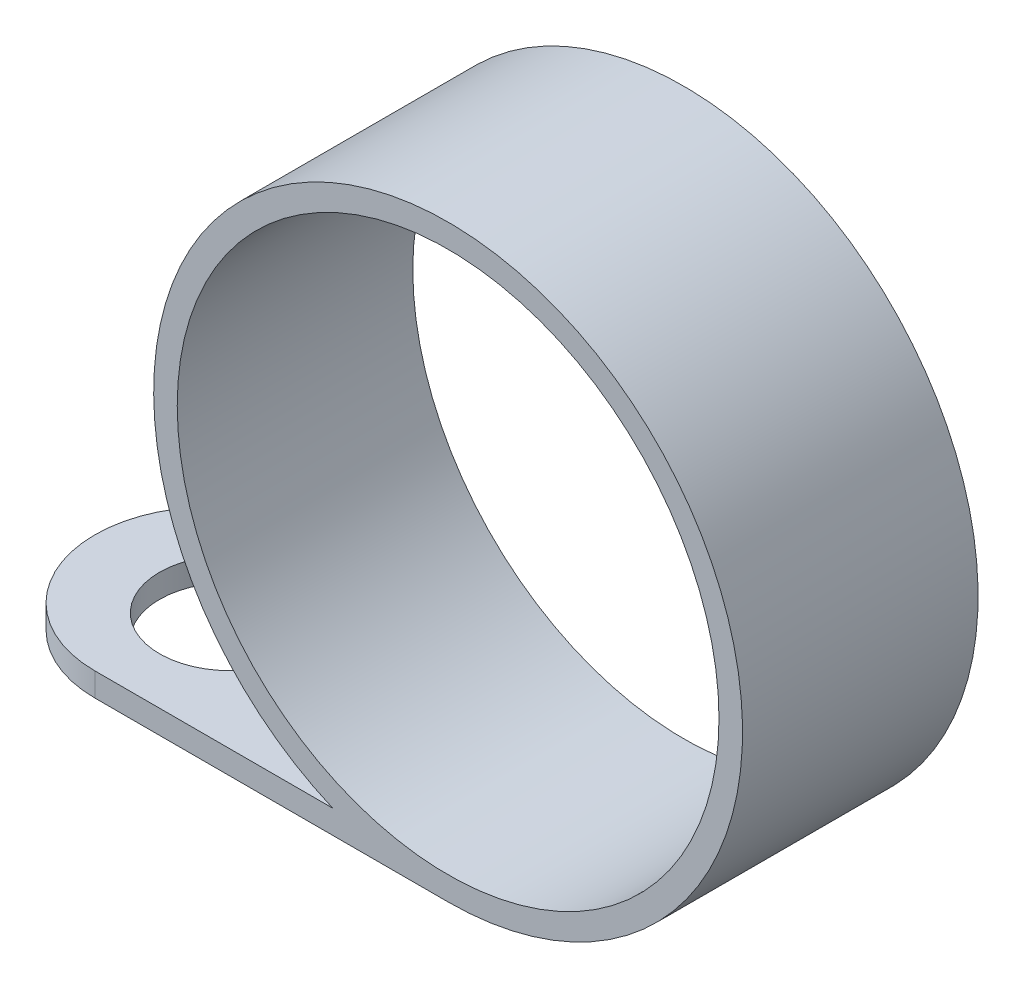
ISO-10303-21;
HEADER;
FILE_DESCRIPTION(('STEP AP214'),'2;1');
FILE_NAME('part.step','',(''),(''),'','','');
FILE_SCHEMA(('AUTOMOTIVE_DESIGN { 1 0 10303 214 1 1 1 1 }'));
ENDSEC;
DATA;
#1=APPLICATION_CONTEXT('core data for automotive mechanical design processes');
#2=APPLICATION_PROTOCOL_DEFINITION('international standard','automotive_design',2000,#1);
#3=PRODUCT_CONTEXT('',#1,'mechanical');
#4=PRODUCT('Part','Part','',(#3));
#5=PRODUCT_RELATED_PRODUCT_CATEGORY('part','',(#4));
#6=PRODUCT_DEFINITION_FORMATION('','',#4);
#7=PRODUCT_DEFINITION_CONTEXT('part definition',#1,'design');
#8=PRODUCT_DEFINITION('design','',#6,#7);
#9=PRODUCT_DEFINITION_SHAPE('','',#8);
#10=(LENGTH_UNIT() NAMED_UNIT(*) SI_UNIT(.MILLI.,.METRE.));
#11=(NAMED_UNIT(*) PLANE_ANGLE_UNIT() SI_UNIT($,.RADIAN.));
#12=(NAMED_UNIT(*) SI_UNIT($,.STERADIAN.) SOLID_ANGLE_UNIT());
#13=UNCERTAINTY_MEASURE_WITH_UNIT(LENGTH_MEASURE(1.E-05),#10,'distance_accuracy_value','');
#14=(GEOMETRIC_REPRESENTATION_CONTEXT(3) GLOBAL_UNCERTAINTY_ASSIGNED_CONTEXT((#13)) GLOBAL_UNIT_ASSIGNED_CONTEXT((#10,
#11,#12)) REPRESENTATION_CONTEXT('',''));
#15=CARTESIAN_POINT('',(0.,0.,0.));
#16=DIRECTION('',(0.,0.,1.));
#17=DIRECTION('',(1.,0.,0.));
#18=AXIS2_PLACEMENT_3D('',#15,#16,#17);
#19=CARTESIAN_POINT('',(5.76916572614213,3.97081850238151,4.819015));
#20=DIRECTION('',(0.,0.,-1.));
#21=DIRECTION('',(-1.,0.,0.));
#22=AXIS2_PLACEMENT_3D('',#19,#20,#21);
#23=PLANE('',#22);
#24=DIRECTION('',(-1.,0.,0.));
#25=VECTOR('',#24,1.);
#26=CARTESIAN_POINT('',(-8.42689427385787,-4.19191599761849,4.819015));
#27=LINE('',#26,#25);
#28=CARTESIAN_POINT('',(2.29185539034867,-4.19191599761849,4.819015));
#29=VERTEX_POINT('',#28);
#30=CARTESIAN_POINT('',(-4.87787927385787,-4.19191599761849,4.819015));
#31=VERTEX_POINT('',#30);
#32=EDGE_CURVE('E117',#29,#31,#27,.T.);
#33=ORIENTED_EDGE('',*,*,#32,.T.);
#34=DIRECTION('',(0.,-1.,0.));
#35=VECTOR('',#34,1.);
#36=CARTESIAN_POINT('',(-4.87787927385787,3.97081850238151,4.819015));
#37=LINE('',#36,#35);
#38=CARTESIAN_POINT('',(-4.87787927385787,-4.90171899761849,4.819015));
#39=VERTEX_POINT('',#38);
#40=EDGE_CURVE('E99',#31,#39,#37,.T.);
#41=ORIENTED_EDGE('',*,*,#40,.T.);
#42=DIRECTION('',(1.,0.,0.));
#43=VECTOR('',#42,1.);
#44=CARTESIAN_POINT('',(-8.42689427385787,-4.90171899761849,4.819015));
#45=LINE('',#44,#43);
#46=CARTESIAN_POINT('',(5.76916572614213,-4.90171899761849,4.819015));
#47=VERTEX_POINT('',#46);
#48=EDGE_CURVE('E91',#39,#47,#45,.T.);
#49=ORIENTED_EDGE('',*,*,#48,.T.);
#50=CARTESIAN_POINT('',(5.76916572614213,3.97081850238151,4.819015));
#51=DIRECTION('',(0.,0.,1.));
#52=DIRECTION('',(-1.,0.,0.));
#53=AXIS2_PLACEMENT_3D('',#50,#51,#52);
#54=CIRCLE('',#53,8.8725375);
#55=EDGE_CURVE('E96',#47,#29,#54,.T.);
#56=ORIENTED_EDGE('',*,*,#55,.T.);
#57=EDGE_LOOP('',(#33,#41,#49,#56));
#58=FACE_BOUND('',#57,.T.);
#59=CARTESIAN_POINT('',(5.76916572614213,3.97081850238151,4.819015));
#60=DIRECTION('',(0.,0.,1.));
#61=DIRECTION('',(1.,0.,0.));
#62=AXIS2_PLACEMENT_3D('',#59,#60,#61);
#63=CIRCLE('',#62,8.1627345);
#64=CARTESIAN_POINT('',(13.9319002261421,3.97081850238151,4.819015));
#65=VERTEX_POINT('',#64);
#66=EDGE_CURVE('E126',#65,#65,#63,.T.);
#67=ORIENTED_EDGE('',*,*,#66,.F.);
#68=EDGE_LOOP('',(#67));
#69=FACE_BOUND('',#68,.T.);
#70=ADVANCED_FACE('F42',(#58,#69),#23,.F.);
#71=CARTESIAN_POINT('',(5.76916572614213,3.97081850238151,-2.279015));
#72=DIRECTION('',(0.,0.,-1.));
#73=DIRECTION('',(-1.,0.,0.));
#74=AXIS2_PLACEMENT_3D('',#71,#72,#73);
#75=PLANE('',#74);
#76=DIRECTION('',(1.,0.,0.));
#77=VECTOR('',#76,1.);
#78=CARTESIAN_POINT('',(-8.42689427385787,-4.90171899761849,-2.279015));
#79=LINE('',#78,#77);
#80=CARTESIAN_POINT('',(-4.87787927385787,-4.90171899761849,-2.279015));
#81=VERTEX_POINT('',#80);
#82=CARTESIAN_POINT('',(5.76916572614213,-4.90171899761849,-2.279015));
#83=VERTEX_POINT('',#82);
#84=EDGE_CURVE('E107',#81,#83,#79,.T.);
#85=ORIENTED_EDGE('',*,*,#84,.F.);
#86=DIRECTION('',(0.,-1.,0.));
#87=VECTOR('',#86,1.);
#88=CARTESIAN_POINT('',(-4.87787927385787,-4.19191599761849,-2.279015));
#89=LINE('',#88,#87);
#90=CARTESIAN_POINT('',(-4.87787927385787,-4.19191599761849,-2.279015));
#91=VERTEX_POINT('',#90);
#92=EDGE_CURVE('E11',#81,#91,#89,.F.);
#93=ORIENTED_EDGE('',*,*,#92,.T.);
#94=DIRECTION('',(-1.,0.,0.));
#95=VECTOR('',#94,1.);
#96=CARTESIAN_POINT('',(-8.42689427385787,-4.19191599761849,-2.279015));
#97=LINE('',#96,#95);
#98=CARTESIAN_POINT('',(2.29185539034867,-4.19191599761849,-2.279015));
#99=VERTEX_POINT('',#98);
#100=EDGE_CURVE('E102',#99,#91,#97,.T.);
#101=ORIENTED_EDGE('',*,*,#100,.F.);
#102=CARTESIAN_POINT('',(5.76916572614213,3.97081850238151,-2.279015));
#103=DIRECTION('',(0.,0.,1.));
#104=DIRECTION('',(-1.,0.,0.));
#105=AXIS2_PLACEMENT_3D('',#102,#103,#104);
#106=CIRCLE('',#105,8.8725375);
#107=EDGE_CURVE('E125',#83,#99,#106,.T.);
#108=ORIENTED_EDGE('',*,*,#107,.F.);
#109=EDGE_LOOP('',(#85,#93,#101,#108));
#110=FACE_BOUND('',#109,.T.);
#111=CARTESIAN_POINT('',(5.76916572614213,3.97081850238151,-2.279015));
#112=DIRECTION('',(0.,0.,1.));
#113=DIRECTION('',(1.,0.,0.));
#114=AXIS2_PLACEMENT_3D('',#111,#112,#113);
#115=CIRCLE('',#114,8.1627345);
#116=CARTESIAN_POINT('',(13.9319002261421,3.97081850238151,-2.279015));
#117=VERTEX_POINT('',#116);
#118=EDGE_CURVE('E161',#117,#117,#115,.T.);
#119=ORIENTED_EDGE('',*,*,#118,.T.);
#120=EDGE_LOOP('',(#119));
#121=FACE_BOUND('',#120,.T.);
#122=ADVANCED_FACE('F170',(#110,#121),#75,.T.);
#123=CARTESIAN_POINT('',(-8.42689427385787,-4.90171899761849,4.819015));
#124=DIRECTION('',(0.,1.,0.));
#125=DIRECTION('',(0.,0.,1.));
#126=AXIS2_PLACEMENT_3D('',#123,#124,#125);
#127=PLANE('',#126);
#128=CARTESIAN_POINT('',(-4.34552702385787,-4.90171899761849,1.27));
#129=DIRECTION('',(0.,1.,0.));
#130=DIRECTION('',(-1.,0.,0.));
#131=AXIS2_PLACEMENT_3D('',#128,#129,#130);
#132=CIRCLE('',#131,2.129409);
#133=CARTESIAN_POINT('',(-6.47493602385787,-4.90171899761849,1.27));
#134=VERTEX_POINT('',#133);
#135=EDGE_CURVE('E155',#134,#134,#132,.T.);
#136=ORIENTED_EDGE('',*,*,#135,.T.);
#137=EDGE_LOOP('',(#136));
#138=FACE_BOUND('',#137,.T.);
#139=ORIENTED_EDGE('',*,*,#48,.F.);
#140=CARTESIAN_POINT('',(-4.87787927385787,-4.90171899761849,1.27));
#141=DIRECTION('',(0.,1.,0.));
#142=DIRECTION('',(0.,0.,1.));
#143=AXIS2_PLACEMENT_3D('',#140,#141,#142);
#144=CIRCLE('',#143,3.549015);
#145=CARTESIAN_POINT('',(-8.42689427385787,-4.90171899761849,1.27));
#146=VERTEX_POINT('',#145);
#147=EDGE_CURVE('E138',#39,#146,#144,.F.);
#148=ORIENTED_EDGE('',*,*,#147,.T.);
#149=CARTESIAN_POINT('',(-4.87787927385787,-4.90171899761849,1.27));
#150=DIRECTION('',(0.,1.,0.));
#151=DIRECTION('',(0.,0.,1.));
#152=AXIS2_PLACEMENT_3D('',#149,#150,#151);
#153=CIRCLE('',#152,3.549015);
#154=EDGE_CURVE('E135',#146,#81,#153,.F.);
#155=ORIENTED_EDGE('',*,*,#154,.T.);
#156=ORIENTED_EDGE('',*,*,#84,.T.);
#157=DIRECTION('',(0.,0.,-1.));
#158=VECTOR('',#157,1.);
#159=CARTESIAN_POINT('',(5.76916572614213,-4.90171899761849,4.819015));
#160=LINE('',#159,#158);
#161=EDGE_CURVE('E105',#47,#83,#160,.T.);
#162=ORIENTED_EDGE('',*,*,#161,.F.);
#163=EDGE_LOOP('',(#139,#148,#155,#156,#162));
#164=FACE_BOUND('',#163,.T.);
#165=ADVANCED_FACE('F106',(#138,#164),#127,.F.);
#166=CARTESIAN_POINT('',(5.76916572614213,3.97081850238151,4.819015));
#167=DIRECTION('',(0.,0.,-1.));
#168=DIRECTION('',(-1.,0.,0.));
#169=AXIS2_PLACEMENT_3D('',#166,#167,#168);
#170=CYLINDRICAL_SURFACE('',#169,8.8725375);
#171=ORIENTED_EDGE('',*,*,#107,.T.);
#172=DIRECTION('',(0.,0.,-1.));
#173=VECTOR('',#172,1.);
#174=CARTESIAN_POINT('',(2.29185539034867,-4.19191599761849,4.819015));
#175=LINE('',#174,#173);
#176=EDGE_CURVE('E111',#29,#99,#175,.T.);
#177=ORIENTED_EDGE('',*,*,#176,.F.);
#178=ORIENTED_EDGE('',*,*,#55,.F.);
#179=ORIENTED_EDGE('',*,*,#161,.T.);
#180=EDGE_LOOP('',(#171,#177,#178,#179));
#181=FACE_BOUND('',#180,.T.);
#182=ADVANCED_FACE('F113',(#181),#170,.T.);
#183=CARTESIAN_POINT('',(-8.42689427385787,-4.19191599761849,4.819015));
#184=DIRECTION('',(0.,-1.,0.));
#185=DIRECTION('',(1.,0.,0.));
#186=AXIS2_PLACEMENT_3D('',#183,#184,#185);
#187=PLANE('',#186);
#188=CARTESIAN_POINT('',(-4.34552702385787,-4.19191599761849,1.27));
#189=DIRECTION('',(0.,1.,0.));
#190=DIRECTION('',(-1.,0.,0.));
#191=AXIS2_PLACEMENT_3D('',#188,#189,#190);
#192=CIRCLE('',#191,2.129409);
#193=CARTESIAN_POINT('',(-6.47493602385787,-4.19191599761849,1.27));
#194=VERTEX_POINT('',#193);
#195=EDGE_CURVE('E152',#194,#194,#192,.T.);
#196=ORIENTED_EDGE('',*,*,#195,.F.);
#197=EDGE_LOOP('',(#196));
#198=FACE_BOUND('',#197,.T.);
#199=CARTESIAN_POINT('',(-4.87787927385787,-4.19191599761849,1.27));
#200=DIRECTION('',(0.,-1.,0.));
#201=DIRECTION('',(1.,0.,0.));
#202=AXIS2_PLACEMENT_3D('',#199,#200,#201);
#203=CIRCLE('',#202,3.549015);
#204=CARTESIAN_POINT('',(-8.42689427385787,-4.19191599761849,1.27));
#205=VERTEX_POINT('',#204);
#206=EDGE_CURVE('E59',#91,#205,#203,.F.);
#207=ORIENTED_EDGE('',*,*,#206,.T.);
#208=CARTESIAN_POINT('',(-4.87787927385787,-4.19191599761849,1.27));
#209=DIRECTION('',(0.,-1.,0.));
#210=DIRECTION('',(1.,0.,0.));
#211=AXIS2_PLACEMENT_3D('',#208,#209,#210);
#212=CIRCLE('',#211,3.549015);
#213=EDGE_CURVE('E52',#205,#31,#212,.F.);
#214=ORIENTED_EDGE('',*,*,#213,.T.);
#215=ORIENTED_EDGE('',*,*,#32,.F.);
#216=ORIENTED_EDGE('',*,*,#176,.T.);
#217=ORIENTED_EDGE('',*,*,#100,.T.);
#218=EDGE_LOOP('',(#207,#214,#215,#216,#217));
#219=FACE_BOUND('',#218,.T.);
#220=ADVANCED_FACE('F145',(#198,#219),#187,.F.);
#221=CARTESIAN_POINT('',(5.76916572614213,3.97081850238151,4.819015));
#222=DIRECTION('',(0.,0.,-1.));
#223=DIRECTION('',(-1.,0.,0.));
#224=AXIS2_PLACEMENT_3D('',#221,#222,#223);
#225=CYLINDRICAL_SURFACE('',#224,8.1627345);
#226=ORIENTED_EDGE('',*,*,#66,.T.);
#227=EDGE_LOOP('',(#226));
#228=FACE_BOUND('',#227,.T.);
#229=ORIENTED_EDGE('',*,*,#118,.F.);
#230=EDGE_LOOP('',(#229));
#231=FACE_BOUND('',#230,.T.);
#232=ADVANCED_FACE('F172',(#228,#231),#225,.F.);
#233=CARTESIAN_POINT('',(-4.34552702385787,-4.90171899761849,1.27));
#234=DIRECTION('',(0.,1.,0.));
#235=DIRECTION('',(-1.,0.,0.));
#236=AXIS2_PLACEMENT_3D('',#233,#234,#235);
#237=CYLINDRICAL_SURFACE('',#236,2.129409);
#238=ORIENTED_EDGE('',*,*,#135,.F.);
#239=EDGE_LOOP('',(#238));
#240=FACE_BOUND('',#239,.T.);
#241=ORIENTED_EDGE('',*,*,#195,.T.);
#242=EDGE_LOOP('',(#241));
#243=FACE_BOUND('',#242,.T.);
#244=ADVANCED_FACE('F174',(#240,#243),#237,.F.);
#245=CARTESIAN_POINT('',(-4.87787927385787,-4.90171899761849,1.27));
#246=DIRECTION('',(0.,1.,0.));
#247=DIRECTION('',(0.,0.,1.));
#248=AXIS2_PLACEMENT_3D('',#245,#246,#247);
#249=CYLINDRICAL_SURFACE('',#248,3.549015);
#250=DIRECTION('',(0.,-1.,0.));
#251=VECTOR('',#250,1.);
#252=CARTESIAN_POINT('',(-8.42689427385787,-4.90171899761849,1.27));
#253=LINE('',#252,#251);
#254=EDGE_CURVE('E46',#205,#146,#253,.T.);
#255=ORIENTED_EDGE('',*,*,#254,.F.);
#256=ORIENTED_EDGE('',*,*,#206,.F.);
#257=ORIENTED_EDGE('',*,*,#92,.F.);
#258=ORIENTED_EDGE('',*,*,#154,.F.);
#259=EDGE_LOOP('',(#255,#256,#257,#258));
#260=FACE_BOUND('',#259,.T.);
#261=ADVANCED_FACE('F44',(#260),#249,.T.);
#262=CARTESIAN_POINT('',(-4.87787927385787,3.97081850238151,1.27));
#263=DIRECTION('',(0.,-1.,0.));
#264=DIRECTION('',(0.,0.,-1.));
#265=AXIS2_PLACEMENT_3D('',#262,#263,#264);
#266=CYLINDRICAL_SURFACE('',#265,3.549015);
#267=ORIENTED_EDGE('',*,*,#213,.F.);
#268=ORIENTED_EDGE('',*,*,#254,.T.);
#269=ORIENTED_EDGE('',*,*,#147,.F.);
#270=ORIENTED_EDGE('',*,*,#40,.F.);
#271=EDGE_LOOP('',(#267,#268,#269,#270));
#272=FACE_BOUND('',#271,.T.);
#273=ADVANCED_FACE('F148',(#272),#266,.T.);
#274=CLOSED_SHELL('',(#70,#122,#165,#182,#220,#232,#244,#261,#273));
#275=MANIFOLD_SOLID_BREP('B2',#274);
#276=ADVANCED_BREP_SHAPE_REPRESENTATION('',(#18,#275),#14);
#277=SHAPE_DEFINITION_REPRESENTATION(#9,#276);
ENDSEC;
END-ISO-10303-21;
